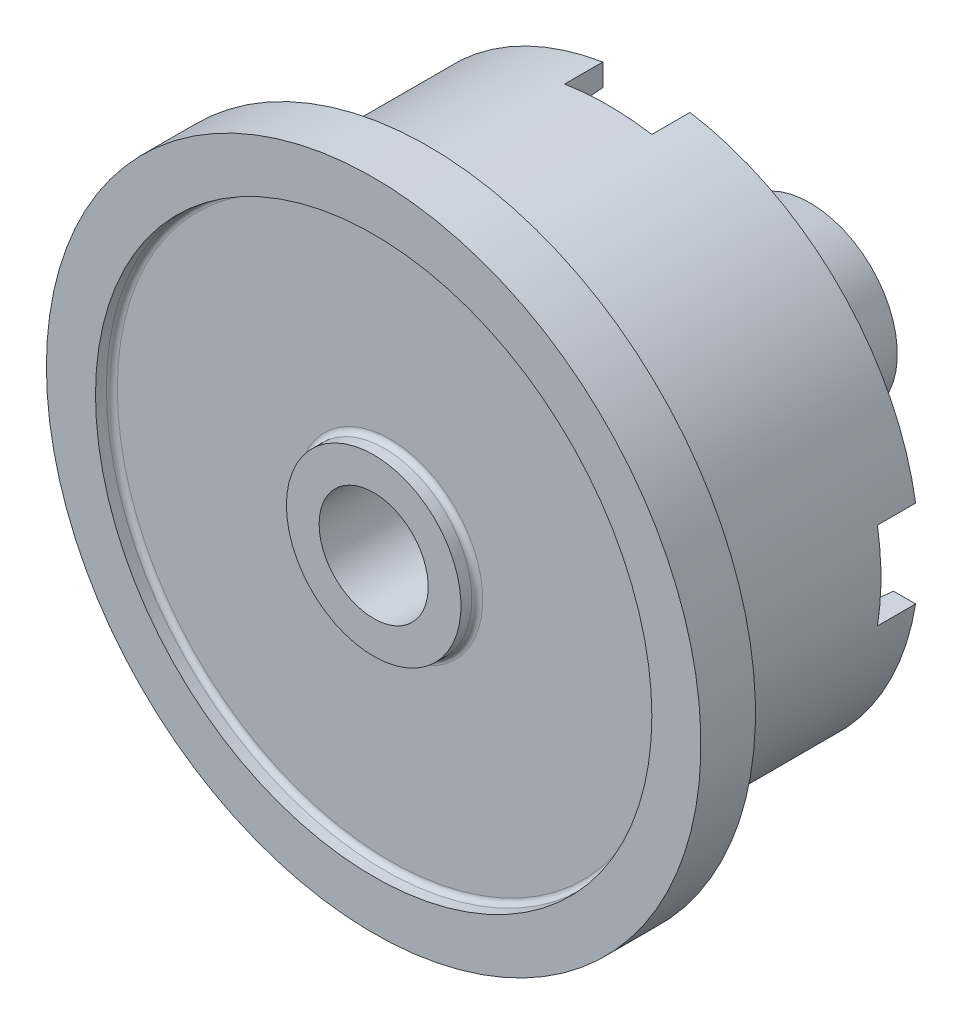
ISO-10303-21;
HEADER;
FILE_DESCRIPTION(('STEP AP214'),'2;1');
FILE_NAME('part.step','',(''),(''),'','','');
FILE_SCHEMA(('AUTOMOTIVE_DESIGN { 1 0 10303 214 1 1 1 1 }'));
ENDSEC;
DATA;
#1=APPLICATION_CONTEXT('core data for automotive mechanical design processes');
#2=APPLICATION_PROTOCOL_DEFINITION('international standard','automotive_design',2000,#1);
#3=PRODUCT_CONTEXT('',#1,'mechanical');
#4=PRODUCT('Part','Part','',(#3));
#5=PRODUCT_RELATED_PRODUCT_CATEGORY('part','',(#4));
#6=PRODUCT_DEFINITION_FORMATION('','',#4);
#7=PRODUCT_DEFINITION_CONTEXT('part definition',#1,'design');
#8=PRODUCT_DEFINITION('design','',#6,#7);
#9=PRODUCT_DEFINITION_SHAPE('','',#8);
#10=(LENGTH_UNIT() NAMED_UNIT(*) SI_UNIT(.MILLI.,.METRE.));
#11=(NAMED_UNIT(*) PLANE_ANGLE_UNIT() SI_UNIT($,.RADIAN.));
#12=(NAMED_UNIT(*) SI_UNIT($,.STERADIAN.) SOLID_ANGLE_UNIT());
#13=UNCERTAINTY_MEASURE_WITH_UNIT(LENGTH_MEASURE(1.E-05),#10,'distance_accuracy_value','');
#14=(GEOMETRIC_REPRESENTATION_CONTEXT(3) GLOBAL_UNCERTAINTY_ASSIGNED_CONTEXT((#13)) GLOBAL_UNIT_ASSIGNED_CONTEXT((#10,
#11,#12)) REPRESENTATION_CONTEXT('',''));
#15=CARTESIAN_POINT('',(0.,0.,0.));
#16=DIRECTION('',(0.,0.,1.));
#17=DIRECTION('',(1.,0.,0.));
#18=AXIS2_PLACEMENT_3D('',#15,#16,#17);
#19=CARTESIAN_POINT('',(10.,0.,70.));
#20=DIRECTION('',(0.,0.,-1.));
#21=DIRECTION('',(-1.,0.,0.));
#22=AXIS2_PLACEMENT_3D('',#19,#20,#21);
#23=CONICAL_SURFACE('',#22,42.,0.0996686524911617);
#24=CARTESIAN_POINT('',(10.,0.,70.));
#25=DIRECTION('',(0.,0.,-1.));
#26=DIRECTION('',(-1.,0.,0.));
#27=AXIS2_PLACEMENT_3D('',#24,#25,#26);
#28=CIRCLE('',#27,42.);
#29=CARTESIAN_POINT('',(-32.,0.,70.));
#30=VERTEX_POINT('',#29);
#31=EDGE_CURVE('E294',#30,#30,#28,.T.);
#32=ORIENTED_EDGE('',*,*,#31,.F.);
#33=EDGE_LOOP('',(#32));
#34=FACE_BOUND('',#33,.T.);
#35=CARTESIAN_POINT('',(10.,0.,30.));
#36=DIRECTION('',(0.,0.,-1.));
#37=DIRECTION('',(-1.,0.,0.));
#38=AXIS2_PLACEMENT_3D('',#35,#36,#37);
#39=CIRCLE('',#38,46.);
#40=CARTESIAN_POINT('',(-35.2990066116245,8.,30.));
#41=VERTEX_POINT('',#40);
#42=CARTESIAN_POINT('',(2.00000000000016,45.2990066116245,30.));
#43=VERTEX_POINT('',#42);
#44=EDGE_CURVE('E291',#41,#43,#39,.T.);
#45=ORIENTED_EDGE('',*,*,#44,.T.);
#46=CARTESIAN_POINT('',(2.00000000000016,46.8538409665136,14.6809057785133));
#47=CARTESIAN_POINT('',(2.00000000000016,46.3048760230467,20.0924536551285));
#48=CARTESIAN_POINT('',(2.00000000000016,45.7556094728386,25.5039709018128));
#49=CARTESIAN_POINT('',(2.00000000000016,44.6564731588152,36.3269441365454));
#50=CARTESIAN_POINT('',(2.00000000000016,44.1066033949999,41.7384001245937));
#51=CARTESIAN_POINT('',(2.00000000000016,43.5564320244431,47.1498254827112));
#52=B_SPLINE_CURVE_WITH_KNOTS('',3,(#46,#47,#48,#49,#50,#51),.UNSPECIFIED.,.F.,.F.,(4,2,4),(0.,
16.3179629209363,32.6359258455688),.UNSPECIFIED.);
#53=CARTESIAN_POINT('',(2.00000000000016,44.5880028707275,37.));
#54=VERTEX_POINT('',#53);
#55=EDGE_CURVE('E365',#43,#54,#52,.T.);
#56=ORIENTED_EDGE('',*,*,#55,.T.);
#57=CARTESIAN_POINT('',(10.,0.,37.));
#58=DIRECTION('',(0.,0.,-1.));
#59=DIRECTION('',(-1.,0.,0.));
#60=AXIS2_PLACEMENT_3D('',#57,#58,#59);
#61=CIRCLE('',#60,45.3);
#62=CARTESIAN_POINT('',(18.0000000000002,44.5880028707274,37.));
#63=VERTEX_POINT('',#62);
#64=EDGE_CURVE('E377',#54,#63,#61,.T.);
#65=ORIENTED_EDGE('',*,*,#64,.T.);
#66=CARTESIAN_POINT('',(18.0000000000002,46.8538409665135,14.6809057785133));
#67=CARTESIAN_POINT('',(18.0000000000002,46.3048760230467,20.0924536551285));
#68=CARTESIAN_POINT('',(18.0000000000002,45.7556094728385,25.5039709018128));
#69=CARTESIAN_POINT('',(18.0000000000002,44.6564731588152,36.3269441365454));
#70=CARTESIAN_POINT('',(18.0000000000002,44.1066033949998,41.7384001245937));
#71=CARTESIAN_POINT('',(18.0000000000002,43.5564320244431,47.1498254827112));
#72=B_SPLINE_CURVE_WITH_KNOTS('',3,(#66,#67,#68,#69,#70,#71),.UNSPECIFIED.,.F.,.F.,(4,2,4),(0.,
16.3179629209363,32.6359258455688),.UNSPECIFIED.);
#73=CARTESIAN_POINT('',(18.0000000000002,45.2990066116245,30.));
#74=VERTEX_POINT('',#73);
#75=EDGE_CURVE('E167',#74,#63,#72,.T.);
#76=ORIENTED_EDGE('',*,*,#75,.F.);
#77=CARTESIAN_POINT('',(55.2990066116245,8.,30.));
#78=VERTEX_POINT('',#77);
#79=EDGE_CURVE('E295',#74,#78,#39,.T.);
#80=ORIENTED_EDGE('',*,*,#79,.T.);
#81=CARTESIAN_POINT('',(56.8538409665136,8.,14.6809057785133));
#82=CARTESIAN_POINT('',(56.3048760230467,8.,20.0924536551285));
#83=CARTESIAN_POINT('',(55.7556094728386,8.,25.5039709018128));
#84=CARTESIAN_POINT('',(54.6564731588152,8.,36.3269441365454));
#85=CARTESIAN_POINT('',(54.1066033949999,8.,41.7384001245937));
#86=CARTESIAN_POINT('',(53.5564320244431,8.,47.1498254827112));
#87=B_SPLINE_CURVE_WITH_KNOTS('',3,(#81,#82,#83,#84,#85,#86),.UNSPECIFIED.,.F.,.F.,(4,2,4),(0.,
16.3179629209363,32.6359258455688),.UNSPECIFIED.);
#88=CARTESIAN_POINT('',(54.5880028707275,8.,37.));
#89=VERTEX_POINT('',#88);
#90=EDGE_CURVE('E442',#78,#89,#87,.T.);
#91=ORIENTED_EDGE('',*,*,#90,.T.);
#92=CARTESIAN_POINT('',(10.,0.,37.));
#93=DIRECTION('',(0.,0.,-1.));
#94=DIRECTION('',(-1.,0.,0.));
#95=AXIS2_PLACEMENT_3D('',#92,#93,#94);
#96=CIRCLE('',#95,45.3);
#97=CARTESIAN_POINT('',(54.5880028707275,-8.,37.));
#98=VERTEX_POINT('',#97);
#99=EDGE_CURVE('E451',#89,#98,#96,.T.);
#100=ORIENTED_EDGE('',*,*,#99,.T.);
#101=CARTESIAN_POINT('',(56.8538409665136,-8.,14.6809057785133));
#102=CARTESIAN_POINT('',(56.3048760230467,-8.,20.0924536551285));
#103=CARTESIAN_POINT('',(55.7556094728386,-8.,25.5039709018128));
#104=CARTESIAN_POINT('',(54.6564731588152,-8.,36.3269441365454));
#105=CARTESIAN_POINT('',(54.1066033949999,-8.,41.7384001245937));
#106=CARTESIAN_POINT('',(53.5564320244431,-8.,47.1498254827112));
#107=B_SPLINE_CURVE_WITH_KNOTS('',3,(#101,#102,#103,#104,#105,#106),.UNSPECIFIED.,.F.,.F.,(4,2,
4),(0.,16.3179629209363,32.6359258455688),.UNSPECIFIED.);
#108=CARTESIAN_POINT('',(55.2990066116245,-8.,30.));
#109=VERTEX_POINT('',#108);
#110=EDGE_CURVE('E447',#109,#98,#107,.T.);
#111=ORIENTED_EDGE('',*,*,#110,.F.);
#112=CARTESIAN_POINT('',(17.9999999999995,-45.2990066116246,30.));
#113=VERTEX_POINT('',#112);
#114=EDGE_CURVE('E379',#109,#113,#39,.T.);
#115=ORIENTED_EDGE('',*,*,#114,.T.);
#116=CARTESIAN_POINT('',(17.9999999999995,-46.8538409665136,14.6809057785134));
#117=CARTESIAN_POINT('',(17.9999999999995,-46.3048760230468,20.0924536551285));
#118=CARTESIAN_POINT('',(17.9999999999995,-45.7556094728386,25.5039709018128));
#119=CARTESIAN_POINT('',(17.9999999999995,-44.6564731588153,36.3269441365454));
#120=CARTESIAN_POINT('',(17.9999999999995,-44.1066033949999,41.7384001245937));
#121=CARTESIAN_POINT('',(17.9999999999995,-43.5564320244432,47.1498254827111));
#122=B_SPLINE_CURVE_WITH_KNOTS('',3,(#116,#117,#118,#119,#120,#121),.UNSPECIFIED.,.F.,.F.,(4,2,
4),(0.,16.3179629209362,32.6359258455687),.UNSPECIFIED.);
#123=CARTESIAN_POINT('',(17.9999999999995,-44.5880028707275,37.));
#124=VERTEX_POINT('',#123);
#125=EDGE_CURVE('E233',#113,#124,#122,.T.);
#126=ORIENTED_EDGE('',*,*,#125,.T.);
#127=CARTESIAN_POINT('',(10.,0.,37.));
#128=DIRECTION('',(0.,0.,-1.));
#129=DIRECTION('',(-1.,0.,0.));
#130=AXIS2_PLACEMENT_3D('',#127,#128,#129);
#131=CIRCLE('',#130,45.3);
#132=CARTESIAN_POINT('',(1.99999999999954,-44.5880028707274,37.));
#133=VERTEX_POINT('',#132);
#134=EDGE_CURVE('E184',#124,#133,#131,.T.);
#135=ORIENTED_EDGE('',*,*,#134,.T.);
#136=CARTESIAN_POINT('',(1.99999999999951,-46.8538409665135,14.6809057785133));
#137=CARTESIAN_POINT('',(1.99999999999952,-46.3048760230466,20.0924536551284));
#138=CARTESIAN_POINT('',(1.99999999999952,-45.7556094728385,25.5039709018127));
#139=CARTESIAN_POINT('',(1.99999999999954,-44.6564731588151,36.3269441365454));
#140=CARTESIAN_POINT('',(1.99999999999954,-44.1066033949998,41.7384001245938));
#141=CARTESIAN_POINT('',(1.99999999999955,-43.556432024443,47.1498254827112));
#142=B_SPLINE_CURVE_WITH_KNOTS('',3,(#136,#137,#138,#139,#140,#141),.UNSPECIFIED.,.F.,.F.,(4,2,
4),(0.,16.3179629209364,32.6359258455689),.UNSPECIFIED.);
#143=CARTESIAN_POINT('',(1.99999999999953,-45.2990066116244,30.));
#144=VERTEX_POINT('',#143);
#145=EDGE_CURVE('E226',#144,#133,#142,.T.);
#146=ORIENTED_EDGE('',*,*,#145,.F.);
#147=CARTESIAN_POINT('',(-35.2990066116245,-8.,30.));
#148=VERTEX_POINT('',#147);
#149=EDGE_CURVE('E290',#144,#148,#39,.T.);
#150=ORIENTED_EDGE('',*,*,#149,.T.);
#151=CARTESIAN_POINT('',(-36.8538409665136,-8.,14.6809057785133));
#152=CARTESIAN_POINT('',(-36.3048760230467,-8.,20.0924536551285));
#153=CARTESIAN_POINT('',(-35.7556094728385,-8.,25.5039709018128));
#154=CARTESIAN_POINT('',(-34.6564731588152,-8.,36.3269441365454));
#155=CARTESIAN_POINT('',(-34.1066033949998,-8.,41.7384001245937));
#156=CARTESIAN_POINT('',(-33.5564320244431,-8.,47.1498254827112));
#157=B_SPLINE_CURVE_WITH_KNOTS('',3,(#151,#152,#153,#154,#155,#156),.UNSPECIFIED.,.F.,.F.,(4,2,
4),(0.,16.3179629209363,32.6359258455688),.UNSPECIFIED.);
#158=CARTESIAN_POINT('',(-34.5880028707275,-8.,37.));
#159=VERTEX_POINT('',#158);
#160=EDGE_CURVE('E265',#148,#159,#157,.T.);
#161=ORIENTED_EDGE('',*,*,#160,.T.);
#162=CARTESIAN_POINT('',(10.,0.,37.));
#163=DIRECTION('',(0.,0.,-1.));
#164=DIRECTION('',(-1.,0.,0.));
#165=AXIS2_PLACEMENT_3D('',#162,#163,#164);
#166=CIRCLE('',#165,45.3);
#167=CARTESIAN_POINT('',(-34.5880028707275,8.,37.));
#168=VERTEX_POINT('',#167);
#169=EDGE_CURVE('E407',#159,#168,#166,.T.);
#170=ORIENTED_EDGE('',*,*,#169,.T.);
#171=CARTESIAN_POINT('',(-36.8538409665136,8.,14.6809057785133));
#172=CARTESIAN_POINT('',(-36.3048760230467,8.,20.0924536551285));
#173=CARTESIAN_POINT('',(-35.7556094728385,8.,25.5039709018128));
#174=CARTESIAN_POINT('',(-34.6564731588152,8.,36.3269441365454));
#175=CARTESIAN_POINT('',(-34.1066033949998,8.,41.7384001245937));
#176=CARTESIAN_POINT('',(-33.5564320244431,8.,47.1498254827112));
#177=B_SPLINE_CURVE_WITH_KNOTS('',3,(#171,#172,#173,#174,#175,#176),.UNSPECIFIED.,.F.,.F.,(4,2,
4),(0.,16.3179629209363,32.6359258455688),.UNSPECIFIED.);
#178=EDGE_CURVE('E273',#41,#168,#177,.T.);
#179=ORIENTED_EDGE('',*,*,#178,.F.);
#180=EDGE_LOOP('',(#45,#56,#65,#76,#80,#91,#100,#111,#115,#126,#135,#146,#150,#161,#170,#179));
#181=FACE_BOUND('',#180,.T.);
#182=ADVANCED_FACE('F47',(#34,#181),#23,.F.);
#183=CARTESIAN_POINT('',(-40.,0.,30.));
#184=DIRECTION('',(0.,0.,-1.));
#185=DIRECTION('',(-1.,0.,0.));
#186=AXIS2_PLACEMENT_3D('',#183,#184,#185);
#187=PLANE('',#186);
#188=CARTESIAN_POINT('',(10.,0.,30.));
#189=DIRECTION('',(0.,0.,-1.));
#190=DIRECTION('',(-1.,0.,0.));
#191=AXIS2_PLACEMENT_3D('',#188,#189,#190);
#192=CIRCLE('',#191,50.);
#193=CARTESIAN_POINT('',(-39.3558507170123,8.,30.));
#194=VERTEX_POINT('',#193);
#195=CARTESIAN_POINT('',(2.00000000000017,49.3558507170123,30.));
#196=VERTEX_POINT('',#195);
#197=EDGE_CURVE('E287',#194,#196,#192,.T.);
#198=ORIENTED_EDGE('',*,*,#197,.T.);
#199=DIRECTION('',(0.,-1.,0.));
#200=VECTOR('',#199,1.);
#201=CARTESIAN_POINT('',(2.00000000000005,10.,30.));
#202=LINE('',#201,#200);
#203=EDGE_CURVE('E175',#196,#43,#202,.T.);
#204=ORIENTED_EDGE('',*,*,#203,.T.);
#205=ORIENTED_EDGE('',*,*,#44,.F.);
#206=DIRECTION('',(1.,0.,0.));
#207=VECTOR('',#206,1.);
#208=CARTESIAN_POINT('',(0.,8.,30.));
#209=LINE('',#208,#207);
#210=EDGE_CURVE('E369',#194,#41,#209,.T.);
#211=ORIENTED_EDGE('',*,*,#210,.F.);
#212=EDGE_LOOP('',(#198,#204,#205,#211));
#213=FACE_BOUND('',#212,.T.);
#214=ADVANCED_FACE('F352',(#213),#187,.T.);
#215=DIRECTION('',(0.,-1.,0.));
#216=VECTOR('',#215,1.);
#217=CARTESIAN_POINT('',(18.,9.99999999999997,30.));
#218=LINE('',#217,#216);
#219=CARTESIAN_POINT('',(18.0000000000002,49.3558507170123,30.));
#220=VERTEX_POINT('',#219);
#221=EDGE_CURVE('E204',#220,#74,#218,.T.);
#222=ORIENTED_EDGE('',*,*,#221,.F.);
#223=CARTESIAN_POINT('',(59.3558507170123,8.,30.));
#224=VERTEX_POINT('',#223);
#225=EDGE_CURVE('E181',#220,#224,#192,.T.);
#226=ORIENTED_EDGE('',*,*,#225,.T.);
#227=DIRECTION('',(-1.,0.,0.));
#228=VECTOR('',#227,1.);
#229=CARTESIAN_POINT('',(20.,7.99999999999999,30.));
#230=LINE('',#229,#228);
#231=EDGE_CURVE('E192',#224,#78,#230,.T.);
#232=ORIENTED_EDGE('',*,*,#231,.T.);
#233=ORIENTED_EDGE('',*,*,#79,.F.);
#234=EDGE_LOOP('',(#222,#226,#232,#233));
#235=FACE_BOUND('',#234,.T.);
#236=ADVANCED_FACE('F357',(#235),#187,.T.);
#237=DIRECTION('',(-1.,0.,0.));
#238=VECTOR('',#237,1.);
#239=CARTESIAN_POINT('',(20.,-8.,30.));
#240=LINE('',#239,#238);
#241=CARTESIAN_POINT('',(59.3558507170123,-8.,30.));
#242=VERTEX_POINT('',#241);
#243=EDGE_CURVE('E197',#242,#109,#240,.T.);
#244=ORIENTED_EDGE('',*,*,#243,.F.);
#245=CARTESIAN_POINT('',(17.9999999999995,-49.3558507170124,30.));
#246=VERTEX_POINT('',#245);
#247=EDGE_CURVE('E460',#242,#246,#192,.T.);
#248=ORIENTED_EDGE('',*,*,#247,.T.);
#249=DIRECTION('',(0.,1.,0.));
#250=VECTOR('',#249,1.);
#251=CARTESIAN_POINT('',(17.9999999999999,-10.0000000000001,30.));
#252=LINE('',#251,#250);
#253=EDGE_CURVE('E210',#246,#113,#252,.T.);
#254=ORIENTED_EDGE('',*,*,#253,.T.);
#255=ORIENTED_EDGE('',*,*,#114,.F.);
#256=EDGE_LOOP('',(#244,#248,#254,#255));
#257=FACE_BOUND('',#256,.T.);
#258=ADVANCED_FACE('F458',(#257),#187,.T.);
#259=CARTESIAN_POINT('',(10.,0.,0.));
#260=DIRECTION('',(0.,0.,-1.));
#261=DIRECTION('',(-1.,0.,0.));
#262=AXIS2_PLACEMENT_3D('',#259,#260,#261);
#263=CYLINDRICAL_SURFACE('',#262,50.);
#264=CARTESIAN_POINT('',(10.,0.,70.));
#265=DIRECTION('',(0.,0.,-1.));
#266=DIRECTION('',(-1.,0.,0.));
#267=AXIS2_PLACEMENT_3D('',#264,#265,#266);
#268=CIRCLE('',#267,50.);
#269=CARTESIAN_POINT('',(-40.,0.,70.));
#270=VERTEX_POINT('',#269);
#271=EDGE_CURVE('E283',#270,#270,#268,.T.);
#272=ORIENTED_EDGE('',*,*,#271,.T.);
#273=EDGE_LOOP('',(#272));
#274=FACE_BOUND('',#273,.T.);
#275=CARTESIAN_POINT('',(10.,0.,37.));
#276=DIRECTION('',(0.,0.,-1.));
#277=DIRECTION('',(0.,1.,0.));
#278=AXIS2_PLACEMENT_3D('',#275,#276,#277);
#279=CIRCLE('',#278,50.);
#280=CARTESIAN_POINT('',(2.00000000000018,49.3558507170123,37.));
#281=VERTEX_POINT('',#280);
#282=CARTESIAN_POINT('',(18.0000000000002,49.3558507170123,37.));
#283=VERTEX_POINT('',#282);
#284=EDGE_CURVE('E169',#281,#283,#279,.T.);
#285=ORIENTED_EDGE('',*,*,#284,.F.);
#286=DIRECTION('',(0.,0.,-1.));
#287=VECTOR('',#286,1.);
#288=CARTESIAN_POINT('',(2.00000000000017,49.3558507170123,37.));
#289=LINE('',#288,#287);
#290=EDGE_CURVE('E182',#281,#196,#289,.T.);
#291=ORIENTED_EDGE('',*,*,#290,.T.);
#292=ORIENTED_EDGE('',*,*,#197,.F.);
#293=DIRECTION('',(0.,0.,-1.));
#294=VECTOR('',#293,1.);
#295=CARTESIAN_POINT('',(-39.3558507170123,8.,37.));
#296=LINE('',#295,#294);
#297=CARTESIAN_POINT('',(-39.3558507170123,8.,37.));
#298=VERTEX_POINT('',#297);
#299=EDGE_CURVE('E408',#298,#194,#296,.T.);
#300=ORIENTED_EDGE('',*,*,#299,.F.);
#301=CARTESIAN_POINT('',(10.,0.,37.));
#302=DIRECTION('',(0.,0.,-1.));
#303=DIRECTION('',(-1.,0.,0.));
#304=AXIS2_PLACEMENT_3D('',#301,#302,#303);
#305=CIRCLE('',#304,50.);
#306=CARTESIAN_POINT('',(-39.3558507170123,-8.,37.));
#307=VERTEX_POINT('',#306);
#308=EDGE_CURVE('E397',#307,#298,#305,.T.);
#309=ORIENTED_EDGE('',*,*,#308,.F.);
#310=DIRECTION('',(0.,0.,-1.));
#311=VECTOR('',#310,1.);
#312=CARTESIAN_POINT('',(-39.3558507170123,-8.,37.));
#313=LINE('',#312,#311);
#314=CARTESIAN_POINT('',(-39.3558507170123,-8.,30.));
#315=VERTEX_POINT('',#314);
#316=EDGE_CURVE('E405',#307,#315,#313,.T.);
#317=ORIENTED_EDGE('',*,*,#316,.T.);
#318=CARTESIAN_POINT('',(1.99999999999949,-49.3558507170122,30.));
#319=VERTEX_POINT('',#318);
#320=EDGE_CURVE('E286',#319,#315,#192,.T.);
#321=ORIENTED_EDGE('',*,*,#320,.F.);
#322=DIRECTION('',(0.,0.,-1.));
#323=VECTOR('',#322,1.);
#324=CARTESIAN_POINT('',(1.99999999999949,-49.3558507170122,37.));
#325=LINE('',#324,#323);
#326=CARTESIAN_POINT('',(1.99999999999949,-49.3558507170122,37.));
#327=VERTEX_POINT('',#326);
#328=EDGE_CURVE('E216',#327,#319,#325,.T.);
#329=ORIENTED_EDGE('',*,*,#328,.F.);
#330=CARTESIAN_POINT('',(10.,0.,37.));
#331=DIRECTION('',(0.,0.,-1.));
#332=DIRECTION('',(0.,-1.,0.));
#333=AXIS2_PLACEMENT_3D('',#330,#331,#332);
#334=CIRCLE('',#333,50.);
#335=CARTESIAN_POINT('',(17.9999999999995,-49.3558507170124,37.));
#336=VERTEX_POINT('',#335);
#337=EDGE_CURVE('E206',#336,#327,#334,.T.);
#338=ORIENTED_EDGE('',*,*,#337,.F.);
#339=DIRECTION('',(0.,0.,-1.));
#340=VECTOR('',#339,1.);
#341=CARTESIAN_POINT('',(17.9999999999995,-49.3558507170124,37.));
#342=LINE('',#341,#340);
#343=EDGE_CURVE('E199',#336,#246,#342,.T.);
#344=ORIENTED_EDGE('',*,*,#343,.T.);
#345=ORIENTED_EDGE('',*,*,#247,.F.);
#346=DIRECTION('',(0.,0.,-1.));
#347=VECTOR('',#346,1.);
#348=CARTESIAN_POINT('',(59.3558507170123,-8.,37.));
#349=LINE('',#348,#347);
#350=CARTESIAN_POINT('',(59.3558507170123,-8.,37.));
#351=VERTEX_POINT('',#350);
#352=EDGE_CURVE('E196',#351,#242,#349,.T.);
#353=ORIENTED_EDGE('',*,*,#352,.F.);
#354=CARTESIAN_POINT('',(10.,0.,37.));
#355=DIRECTION('',(0.,0.,-1.));
#356=DIRECTION('',(1.,0.,0.));
#357=AXIS2_PLACEMENT_3D('',#354,#355,#356);
#358=CIRCLE('',#357,50.);
#359=CARTESIAN_POINT('',(59.3558507170123,8.,37.));
#360=VERTEX_POINT('',#359);
#361=EDGE_CURVE('E189',#360,#351,#358,.T.);
#362=ORIENTED_EDGE('',*,*,#361,.F.);
#363=DIRECTION('',(0.,0.,-1.));
#364=VECTOR('',#363,1.);
#365=CARTESIAN_POINT('',(59.3558507170123,8.,37.));
#366=LINE('',#365,#364);
#367=EDGE_CURVE('E202',#360,#224,#366,.T.);
#368=ORIENTED_EDGE('',*,*,#367,.T.);
#369=ORIENTED_EDGE('',*,*,#225,.F.);
#370=DIRECTION('',(0.,0.,-1.));
#371=VECTOR('',#370,1.);
#372=CARTESIAN_POINT('',(18.0000000000002,49.3558507170123,37.));
#373=LINE('',#372,#371);
#374=EDGE_CURVE('E164',#283,#220,#373,.T.);
#375=ORIENTED_EDGE('',*,*,#374,.F.);
#376=EDGE_LOOP('',(#285,#291,#292,#300,#309,#317,#321,#329,#338,#344,#345,#353,#362,#368,#369,#375));
#377=FACE_BOUND('',#376,.T.);
#378=ADVANCED_FACE('F178',(#274,#377),#263,.T.);
#379=DIRECTION('',(0.,1.,0.));
#380=VECTOR('',#379,1.);
#381=CARTESIAN_POINT('',(1.9999999999999,-9.99999999999992,30.));
#382=LINE('',#381,#380);
#383=EDGE_CURVE('E217',#319,#144,#382,.T.);
#384=ORIENTED_EDGE('',*,*,#383,.F.);
#385=ORIENTED_EDGE('',*,*,#320,.T.);
#386=DIRECTION('',(1.,0.,0.));
#387=VECTOR('',#386,1.);
#388=CARTESIAN_POINT('',(0.,-7.99999999999999,30.));
#389=LINE('',#388,#387);
#390=EDGE_CURVE('E393',#315,#148,#389,.T.);
#391=ORIENTED_EDGE('',*,*,#390,.T.);
#392=ORIENTED_EDGE('',*,*,#149,.F.);
#393=EDGE_LOOP('',(#384,#385,#391,#392));
#394=FACE_BOUND('',#393,.T.);
#395=ADVANCED_FACE('F359',(#394),#187,.T.);
#396=CARTESIAN_POINT('',(-50.,0.,80.));
#397=DIRECTION('',(0.,0.,1.));
#398=DIRECTION('',(1.,0.,0.));
#399=AXIS2_PLACEMENT_3D('',#396,#397,#398);
#400=PLANE('',#399);
#401=CARTESIAN_POINT('',(10.,0.,80.));
#402=DIRECTION('',(0.,0.,-1.));
#403=DIRECTION('',(-1.,0.,0.));
#404=AXIS2_PLACEMENT_3D('',#401,#402,#403);
#405=CIRCLE('',#404,51.);
#406=CARTESIAN_POINT('',(-41.,0.,80.));
#407=VERTEX_POINT('',#406);
#408=EDGE_CURVE('E13',#407,#407,#405,.T.);
#409=ORIENTED_EDGE('',*,*,#408,.T.);
#410=EDGE_LOOP('',(#409));
#411=FACE_BOUND('',#410,.T.);
#412=CARTESIAN_POINT('',(10.,0.,80.));
#413=DIRECTION('',(0.,0.,-1.));
#414=DIRECTION('',(-1.,0.,0.));
#415=AXIS2_PLACEMENT_3D('',#412,#413,#414);
#416=CIRCLE('',#415,60.);
#417=CARTESIAN_POINT('',(-50.,0.,80.));
#418=VERTEX_POINT('',#417);
#419=EDGE_CURVE('E272',#418,#418,#416,.T.);
#420=ORIENTED_EDGE('',*,*,#419,.F.);
#421=EDGE_LOOP('',(#420));
#422=FACE_BOUND('',#421,.T.);
#423=ADVANCED_FACE('F49',(#411,#422),#400,.T.);
#424=CARTESIAN_POINT('',(10.,0.,0.));
#425=DIRECTION('',(0.,0.,-1.));
#426=DIRECTION('',(-1.,0.,0.));
#427=AXIS2_PLACEMENT_3D('',#424,#425,#426);
#428=CYLINDRICAL_SURFACE('',#427,51.);
#429=CARTESIAN_POINT('',(10.,0.,78.));
#430=DIRECTION('',(0.,0.,-1.));
#431=DIRECTION('',(-1.,0.,0.));
#432=AXIS2_PLACEMENT_3D('',#429,#430,#431);
#433=CIRCLE('',#432,51.);
#434=CARTESIAN_POINT('',(-41.,0.,78.));
#435=VERTEX_POINT('',#434);
#436=EDGE_CURVE('E55',#435,#435,#433,.T.);
#437=ORIENTED_EDGE('',*,*,#436,.T.);
#438=EDGE_LOOP('',(#437));
#439=FACE_BOUND('',#438,.T.);
#440=ORIENTED_EDGE('',*,*,#408,.F.);
#441=EDGE_LOOP('',(#440));
#442=FACE_BOUND('',#441,.T.);
#443=ADVANCED_FACE('F336',(#439,#442),#428,.F.);
#444=CARTESIAN_POINT('',(10.,0.,78.));
#445=DIRECTION('',(0.,0.,-1.));
#446=DIRECTION('',(-1.,0.,0.));
#447=AXIS2_PLACEMENT_3D('',#444,#445,#446);
#448=TOROIDAL_SURFACE('',#447,50.,1.);
#449=CARTESIAN_POINT('',(10.,0.,77.));
#450=DIRECTION('',(0.,0.,-1.));
#451=DIRECTION('',(-1.,0.,0.));
#452=AXIS2_PLACEMENT_3D('',#449,#450,#451);
#453=CIRCLE('',#452,50.);
#454=CARTESIAN_POINT('',(-40.,0.,77.));
#455=VERTEX_POINT('',#454);
#456=EDGE_CURVE('E331',#455,#455,#453,.T.);
#457=ORIENTED_EDGE('',*,*,#456,.T.);
#458=EDGE_LOOP('',(#457));
#459=FACE_BOUND('',#458,.T.);
#460=ORIENTED_EDGE('',*,*,#436,.F.);
#461=EDGE_LOOP('',(#460));
#462=FACE_BOUND('',#461,.T.);
#463=ADVANCED_FACE('F339',(#459,#462),#448,.F.);
#464=CARTESIAN_POINT('',(-40.,0.,77.));
#465=DIRECTION('',(0.,0.,1.));
#466=DIRECTION('',(1.,0.,0.));
#467=AXIS2_PLACEMENT_3D('',#464,#465,#466);
#468=PLANE('',#467);
#469=CARTESIAN_POINT('',(10.,0.,77.));
#470=DIRECTION('',(0.,0.,-1.));
#471=DIRECTION('',(-1.,0.,0.));
#472=AXIS2_PLACEMENT_3D('',#469,#470,#471);
#473=CIRCLE('',#472,17.);
#474=CARTESIAN_POINT('',(-6.99999999999999,0.,77.));
#475=VERTEX_POINT('',#474);
#476=EDGE_CURVE('E328',#475,#475,#473,.T.);
#477=ORIENTED_EDGE('',*,*,#476,.T.);
#478=EDGE_LOOP('',(#477));
#479=FACE_BOUND('',#478,.T.);
#480=ORIENTED_EDGE('',*,*,#456,.F.);
#481=EDGE_LOOP('',(#480));
#482=FACE_BOUND('',#481,.T.);
#483=ADVANCED_FACE('F341',(#479,#482),#468,.T.);
#484=CARTESIAN_POINT('',(10.,0.,78.));
#485=DIRECTION('',(0.,0.,-1.));
#486=DIRECTION('',(-1.,0.,0.));
#487=AXIS2_PLACEMENT_3D('',#484,#485,#486);
#488=TOROIDAL_SURFACE('',#487,17.,1.);
#489=CARTESIAN_POINT('',(10.,0.,78.));
#490=DIRECTION('',(0.,0.,-1.));
#491=DIRECTION('',(-1.,0.,0.));
#492=AXIS2_PLACEMENT_3D('',#489,#490,#491);
#493=CIRCLE('',#492,16.);
#494=CARTESIAN_POINT('',(-5.99999999999999,0.,78.));
#495=VERTEX_POINT('',#494);
#496=EDGE_CURVE('E325',#495,#495,#493,.T.);
#497=ORIENTED_EDGE('',*,*,#496,.T.);
#498=EDGE_LOOP('',(#497));
#499=FACE_BOUND('',#498,.T.);
#500=ORIENTED_EDGE('',*,*,#476,.F.);
#501=EDGE_LOOP('',(#500));
#502=FACE_BOUND('',#501,.T.);
#503=ADVANCED_FACE('F348',(#499,#502),#488,.F.);
#504=CARTESIAN_POINT('',(10.,0.,0.));
#505=DIRECTION('',(0.,0.,-1.));
#506=DIRECTION('',(-1.,0.,0.));
#507=AXIS2_PLACEMENT_3D('',#504,#505,#506);
#508=CYLINDRICAL_SURFACE('',#507,16.);
#509=CARTESIAN_POINT('',(10.,0.,80.));
#510=DIRECTION('',(0.,0.,-1.));
#511=DIRECTION('',(-1.,0.,0.));
#512=AXIS2_PLACEMENT_3D('',#509,#510,#511);
#513=CIRCLE('',#512,16.);
#514=CARTESIAN_POINT('',(-5.99999999999999,0.,80.));
#515=VERTEX_POINT('',#514);
#516=EDGE_CURVE('E322',#515,#515,#513,.T.);
#517=ORIENTED_EDGE('',*,*,#516,.T.);
#518=EDGE_LOOP('',(#517));
#519=FACE_BOUND('',#518,.T.);
#520=ORIENTED_EDGE('',*,*,#496,.F.);
#521=EDGE_LOOP('',(#520));
#522=FACE_BOUND('',#521,.T.);
#523=ADVANCED_FACE('F689',(#519,#522),#508,.T.);
#524=CARTESIAN_POINT('',(-5.99999999999999,0.,80.));
#525=DIRECTION('',(0.,0.,1.));
#526=DIRECTION('',(1.,0.,0.));
#527=AXIS2_PLACEMENT_3D('',#524,#525,#526);
#528=PLANE('',#527);
#529=CARTESIAN_POINT('',(10.,0.,80.));
#530=DIRECTION('',(0.,0.,-1.));
#531=DIRECTION('',(-1.,0.,0.));
#532=AXIS2_PLACEMENT_3D('',#529,#530,#531);
#533=CIRCLE('',#532,10.);
#534=CARTESIAN_POINT('',(0.,0.,80.));
#535=VERTEX_POINT('',#534);
#536=EDGE_CURVE('E319',#535,#535,#533,.T.);
#537=ORIENTED_EDGE('',*,*,#536,.T.);
#538=EDGE_LOOP('',(#537));
#539=FACE_BOUND('',#538,.T.);
#540=ORIENTED_EDGE('',*,*,#516,.F.);
#541=EDGE_LOOP('',(#540));
#542=FACE_BOUND('',#541,.T.);
#543=ADVANCED_FACE('F679',(#539,#542),#528,.T.);
#544=CARTESIAN_POINT('',(10.,0.,0.));
#545=DIRECTION('',(0.,0.,-1.));
#546=DIRECTION('',(-1.,0.,0.));
#547=AXIS2_PLACEMENT_3D('',#544,#545,#546);
#548=CYLINDRICAL_SURFACE('',#547,10.);
#549=CARTESIAN_POINT('',(10.,0.,60.));
#550=DIRECTION('',(0.,0.,-1.));
#551=DIRECTION('',(-1.,0.,0.));
#552=AXIS2_PLACEMENT_3D('',#549,#550,#551);
#553=CIRCLE('',#552,10.);
#554=CARTESIAN_POINT('',(0.,0.,60.));
#555=VERTEX_POINT('',#554);
#556=EDGE_CURVE('E316',#555,#555,#553,.T.);
#557=ORIENTED_EDGE('',*,*,#556,.T.);
#558=EDGE_LOOP('',(#557));
#559=FACE_BOUND('',#558,.T.);
#560=ORIENTED_EDGE('',*,*,#536,.F.);
#561=EDGE_LOOP('',(#560));
#562=FACE_BOUND('',#561,.T.);
#563=ADVANCED_FACE('F669',(#559,#562),#548,.F.);
#564=CARTESIAN_POINT('',(0.,0.,60.));
#565=DIRECTION('',(0.,0.,-1.));
#566=DIRECTION('',(-1.,0.,0.));
#567=AXIS2_PLACEMENT_3D('',#564,#565,#566);
#568=PLANE('',#567);
#569=CARTESIAN_POINT('',(10.,0.,60.));
#570=DIRECTION('',(0.,0.,-1.));
#571=DIRECTION('',(-1.,0.,0.));
#572=AXIS2_PLACEMENT_3D('',#569,#570,#571);
#573=CIRCLE('',#572,12.);
#574=CARTESIAN_POINT('',(-1.99999999999999,0.,60.));
#575=VERTEX_POINT('',#574);
#576=EDGE_CURVE('E313',#575,#575,#573,.T.);
#577=ORIENTED_EDGE('',*,*,#576,.T.);
#578=EDGE_LOOP('',(#577));
#579=FACE_BOUND('',#578,.T.);
#580=ORIENTED_EDGE('',*,*,#556,.F.);
#581=EDGE_LOOP('',(#580));
#582=FACE_BOUND('',#581,.T.);
#583=ADVANCED_FACE('F659',(#579,#582),#568,.T.);
#584=CARTESIAN_POINT('',(10.,0.,0.));
#585=DIRECTION('',(0.,0.,-1.));
#586=DIRECTION('',(-1.,0.,0.));
#587=AXIS2_PLACEMENT_3D('',#584,#585,#586);
#588=CYLINDRICAL_SURFACE('',#587,12.);
#589=CARTESIAN_POINT('',(10.,0.,20.));
#590=DIRECTION('',(0.,0.,-1.));
#591=DIRECTION('',(-1.,0.,0.));
#592=AXIS2_PLACEMENT_3D('',#589,#590,#591);
#593=CIRCLE('',#592,12.);
#594=CARTESIAN_POINT('',(-1.99999999999999,0.,20.));
#595=VERTEX_POINT('',#594);
#596=EDGE_CURVE('E310',#595,#595,#593,.T.);
#597=ORIENTED_EDGE('',*,*,#596,.T.);
#598=EDGE_LOOP('',(#597));
#599=FACE_BOUND('',#598,.T.);
#600=ORIENTED_EDGE('',*,*,#576,.F.);
#601=EDGE_LOOP('',(#600));
#602=FACE_BOUND('',#601,.T.);
#603=ADVANCED_FACE('F649',(#599,#602),#588,.F.);
#604=CARTESIAN_POINT('',(0.,0.,20.));
#605=DIRECTION('',(0.,0.,1.));
#606=DIRECTION('',(1.,0.,0.));
#607=AXIS2_PLACEMENT_3D('',#604,#605,#606);
#608=PLANE('',#607);
#609=CARTESIAN_POINT('',(10.,0.,20.));
#610=DIRECTION('',(0.,0.,-1.));
#611=DIRECTION('',(-1.,0.,0.));
#612=AXIS2_PLACEMENT_3D('',#609,#610,#611);
#613=CIRCLE('',#612,10.);
#614=CARTESIAN_POINT('',(0.,0.,20.));
#615=VERTEX_POINT('',#614);
#616=EDGE_CURVE('E307',#615,#615,#613,.T.);
#617=ORIENTED_EDGE('',*,*,#616,.T.);
#618=EDGE_LOOP('',(#617));
#619=FACE_BOUND('',#618,.T.);
#620=ORIENTED_EDGE('',*,*,#596,.F.);
#621=EDGE_LOOP('',(#620));
#622=FACE_BOUND('',#621,.T.);
#623=ADVANCED_FACE('F639',(#619,#622),#608,.T.);
#624=CARTESIAN_POINT('',(10.,0.,0.));
#625=DIRECTION('',(0.,0.,-1.));
#626=DIRECTION('',(-1.,0.,0.));
#627=AXIS2_PLACEMENT_3D('',#624,#625,#626);
#628=CYLINDRICAL_SURFACE('',#627,10.);
#629=CARTESIAN_POINT('',(10.,0.,0.));
#630=DIRECTION('',(0.,0.,-1.));
#631=DIRECTION('',(-1.,0.,0.));
#632=AXIS2_PLACEMENT_3D('',#629,#630,#631);
#633=CIRCLE('',#632,10.);
#634=CARTESIAN_POINT('',(0.,0.,0.));
#635=VERTEX_POINT('',#634);
#636=EDGE_CURVE('E304',#635,#635,#633,.T.);
#637=ORIENTED_EDGE('',*,*,#636,.T.);
#638=EDGE_LOOP('',(#637));
#639=FACE_BOUND('',#638,.T.);
#640=ORIENTED_EDGE('',*,*,#616,.F.);
#641=EDGE_LOOP('',(#640));
#642=FACE_BOUND('',#641,.T.);
#643=ADVANCED_FACE('F629',(#639,#642),#628,.F.);
#644=CARTESIAN_POINT('',(0.,0.,0.));
#645=DIRECTION('',(0.,0.,-1.));
#646=DIRECTION('',(-1.,0.,0.));
#647=AXIS2_PLACEMENT_3D('',#644,#645,#646);
#648=PLANE('',#647);
#649=CARTESIAN_POINT('',(10.,0.,0.));
#650=DIRECTION('',(0.,0.,-1.));
#651=DIRECTION('',(-1.,0.,0.));
#652=AXIS2_PLACEMENT_3D('',#649,#650,#651);
#653=CIRCLE('',#652,16.);
#654=CARTESIAN_POINT('',(-6.,0.,0.));
#655=VERTEX_POINT('',#654);
#656=EDGE_CURVE('E301',#655,#655,#653,.T.);
#657=ORIENTED_EDGE('',*,*,#656,.T.);
#658=EDGE_LOOP('',(#657));
#659=FACE_BOUND('',#658,.T.);
#660=ORIENTED_EDGE('',*,*,#636,.F.);
#661=EDGE_LOOP('',(#660));
#662=FACE_BOUND('',#661,.T.);
#663=ADVANCED_FACE('F619',(#659,#662),#648,.T.);
#664=CARTESIAN_POINT('',(10.,0.,0.));
#665=DIRECTION('',(0.,0.,1.));
#666=DIRECTION('',(1.,0.,0.));
#667=AXIS2_PLACEMENT_3D('',#664,#665,#666);
#668=CONICAL_SURFACE('',#667,16.,0.141897054604164);
#669=CARTESIAN_POINT('',(10.,0.,70.));
#670=DIRECTION('',(0.,0.,-1.));
#671=DIRECTION('',(-1.,0.,0.));
#672=AXIS2_PLACEMENT_3D('',#669,#670,#671);
#673=CIRCLE('',#672,26.);
#674=CARTESIAN_POINT('',(-16.,0.,70.));
#675=VERTEX_POINT('',#674);
#676=EDGE_CURVE('E298',#675,#675,#673,.T.);
#677=ORIENTED_EDGE('',*,*,#676,.T.);
#678=EDGE_LOOP('',(#677));
#679=FACE_BOUND('',#678,.T.);
#680=ORIENTED_EDGE('',*,*,#656,.F.);
#681=EDGE_LOOP('',(#680));
#682=FACE_BOUND('',#681,.T.);
#683=ADVANCED_FACE('F610',(#679,#682),#668,.T.);
#684=CARTESIAN_POINT('',(-32.,0.,70.));
#685=DIRECTION('',(0.,0.,-1.));
#686=DIRECTION('',(-1.,0.,0.));
#687=AXIS2_PLACEMENT_3D('',#684,#685,#686);
#688=PLANE('',#687);
#689=ORIENTED_EDGE('',*,*,#31,.T.);
#690=EDGE_LOOP('',(#689));
#691=FACE_BOUND('',#690,.T.);
#692=ORIENTED_EDGE('',*,*,#676,.F.);
#693=EDGE_LOOP('',(#692));
#694=FACE_BOUND('',#693,.T.);
#695=ADVANCED_FACE('F600',(#691,#694),#688,.T.);
#696=CARTESIAN_POINT('',(-50.,0.,70.));
#697=DIRECTION('',(0.,0.,-1.));
#698=DIRECTION('',(-1.,0.,0.));
#699=AXIS2_PLACEMENT_3D('',#696,#697,#698);
#700=PLANE('',#699);
#701=CARTESIAN_POINT('',(10.,0.,70.));
#702=DIRECTION('',(0.,0.,-1.));
#703=DIRECTION('',(-1.,0.,0.));
#704=AXIS2_PLACEMENT_3D('',#701,#702,#703);
#705=CIRCLE('',#704,60.);
#706=CARTESIAN_POINT('',(-50.,0.,70.));
#707=VERTEX_POINT('',#706);
#708=EDGE_CURVE('E280',#707,#707,#705,.T.);
#709=ORIENTED_EDGE('',*,*,#708,.T.);
#710=EDGE_LOOP('',(#709));
#711=FACE_BOUND('',#710,.T.);
#712=ORIENTED_EDGE('',*,*,#271,.F.);
#713=EDGE_LOOP('',(#712));
#714=FACE_BOUND('',#713,.T.);
#715=ADVANCED_FACE('F591',(#711,#714),#700,.T.);
#716=CARTESIAN_POINT('',(10.,0.,0.));
#717=DIRECTION('',(0.,0.,-1.));
#718=DIRECTION('',(-1.,0.,0.));
#719=AXIS2_PLACEMENT_3D('',#716,#717,#718);
#720=CYLINDRICAL_SURFACE('',#719,60.);
#721=ORIENTED_EDGE('',*,*,#419,.T.);
#722=EDGE_LOOP('',(#721));
#723=FACE_BOUND('',#722,.T.);
#724=ORIENTED_EDGE('',*,*,#708,.F.);
#725=EDGE_LOOP('',(#724));
#726=FACE_BOUND('',#725,.T.);
#727=ADVANCED_FACE('F260',(#723,#726),#720,.T.);
#728=CARTESIAN_POINT('',(0.,-7.99999999999999,37.));
#729=DIRECTION('',(0.,1.,0.));
#730=DIRECTION('',(-1.,0.,0.));
#731=AXIS2_PLACEMENT_3D('',#728,#729,#730);
#732=PLANE('',#731);
#733=ORIENTED_EDGE('',*,*,#390,.F.);
#734=ORIENTED_EDGE('',*,*,#316,.F.);
#735=DIRECTION('',(1.,0.,0.));
#736=VECTOR('',#735,1.);
#737=CARTESIAN_POINT('',(0.,-7.99999999999999,37.));
#738=LINE('',#737,#736);
#739=EDGE_CURVE('E395',#307,#159,#738,.T.);
#740=ORIENTED_EDGE('',*,*,#739,.T.);
#741=ORIENTED_EDGE('',*,*,#160,.F.);
#742=EDGE_LOOP('',(#733,#734,#740,#741));
#743=FACE_BOUND('',#742,.T.);
#744=ADVANCED_FACE('F256',(#743),#732,.T.);
#745=CARTESIAN_POINT('',(0.,8.,37.));
#746=DIRECTION('',(0.,1.,0.));
#747=DIRECTION('',(0.,0.,1.));
#748=AXIS2_PLACEMENT_3D('',#745,#746,#747);
#749=PLANE('',#748);
#750=ORIENTED_EDGE('',*,*,#178,.T.);
#751=DIRECTION('',(1.,0.,0.));
#752=VECTOR('',#751,1.);
#753=CARTESIAN_POINT('',(0.,8.,37.));
#754=LINE('',#753,#752);
#755=EDGE_CURVE('E400',#298,#168,#754,.T.);
#756=ORIENTED_EDGE('',*,*,#755,.F.);
#757=ORIENTED_EDGE('',*,*,#299,.T.);
#758=ORIENTED_EDGE('',*,*,#210,.T.);
#759=EDGE_LOOP('',(#750,#756,#757,#758));
#760=FACE_BOUND('',#759,.T.);
#761=ADVANCED_FACE('F254',(#760),#749,.F.);
#762=CARTESIAN_POINT('',(0.,0.,37.));
#763=DIRECTION('',(0.,0.,-1.));
#764=DIRECTION('',(-1.,0.,0.));
#765=AXIS2_PLACEMENT_3D('',#762,#763,#764);
#766=PLANE('',#765);
#767=ORIENTED_EDGE('',*,*,#739,.F.);
#768=ORIENTED_EDGE('',*,*,#308,.T.);
#769=ORIENTED_EDGE('',*,*,#755,.T.);
#770=ORIENTED_EDGE('',*,*,#169,.F.);
#771=EDGE_LOOP('',(#767,#768,#769,#770));
#772=FACE_BOUND('',#771,.T.);
#773=ADVANCED_FACE('F251',(#772),#766,.T.);
#774=CARTESIAN_POINT('',(17.9999999999999,-10.0000000000001,37.));
#775=DIRECTION('',(-1.,0.,0.));
#776=DIRECTION('',(0.,-1.,0.));
#777=AXIS2_PLACEMENT_3D('',#774,#775,#776);
#778=PLANE('',#777);
#779=ORIENTED_EDGE('',*,*,#253,.F.);
#780=ORIENTED_EDGE('',*,*,#343,.F.);
#781=DIRECTION('',(0.,1.,0.));
#782=VECTOR('',#781,1.);
#783=CARTESIAN_POINT('',(17.9999999999999,-10.0000000000001,37.));
#784=LINE('',#783,#782);
#785=EDGE_CURVE('E213',#336,#124,#784,.T.);
#786=ORIENTED_EDGE('',*,*,#785,.T.);
#787=ORIENTED_EDGE('',*,*,#125,.F.);
#788=EDGE_LOOP('',(#779,#780,#786,#787));
#789=FACE_BOUND('',#788,.T.);
#790=ADVANCED_FACE('F247',(#789),#778,.T.);
#791=CARTESIAN_POINT('',(1.9999999999999,-9.99999999999992,37.));
#792=DIRECTION('',(-1.,0.,0.));
#793=DIRECTION('',(0.,-1.,0.));
#794=AXIS2_PLACEMENT_3D('',#791,#792,#793);
#795=PLANE('',#794);
#796=ORIENTED_EDGE('',*,*,#145,.T.);
#797=DIRECTION('',(0.,1.,0.));
#798=VECTOR('',#797,1.);
#799=CARTESIAN_POINT('',(1.9999999999999,-9.99999999999992,37.));
#800=LINE('',#799,#798);
#801=EDGE_CURVE('E209',#327,#133,#800,.T.);
#802=ORIENTED_EDGE('',*,*,#801,.F.);
#803=ORIENTED_EDGE('',*,*,#328,.T.);
#804=ORIENTED_EDGE('',*,*,#383,.T.);
#805=EDGE_LOOP('',(#796,#802,#803,#804));
#806=FACE_BOUND('',#805,.T.);
#807=ADVANCED_FACE('F242',(#806),#795,.F.);
#808=CARTESIAN_POINT('',(9.9999999999999,-10.,37.));
#809=DIRECTION('',(0.,0.,-1.));
#810=DIRECTION('',(0.,-1.,0.));
#811=AXIS2_PLACEMENT_3D('',#808,#809,#810);
#812=PLANE('',#811);
#813=ORIENTED_EDGE('',*,*,#785,.F.);
#814=ORIENTED_EDGE('',*,*,#337,.T.);
#815=ORIENTED_EDGE('',*,*,#801,.T.);
#816=ORIENTED_EDGE('',*,*,#134,.F.);
#817=EDGE_LOOP('',(#813,#814,#815,#816));
#818=FACE_BOUND('',#817,.T.);
#819=ADVANCED_FACE('F246',(#818),#812,.T.);
#820=CARTESIAN_POINT('',(20.,7.99999999999999,37.));
#821=DIRECTION('',(0.,-1.,0.));
#822=DIRECTION('',(1.,0.,0.));
#823=AXIS2_PLACEMENT_3D('',#820,#821,#822);
#824=PLANE('',#823);
#825=ORIENTED_EDGE('',*,*,#231,.F.);
#826=ORIENTED_EDGE('',*,*,#367,.F.);
#827=DIRECTION('',(-1.,0.,0.));
#828=VECTOR('',#827,1.);
#829=CARTESIAN_POINT('',(20.,7.99999999999999,37.));
#830=LINE('',#829,#828);
#831=EDGE_CURVE('E70',#360,#89,#830,.T.);
#832=ORIENTED_EDGE('',*,*,#831,.T.);
#833=ORIENTED_EDGE('',*,*,#90,.F.);
#834=EDGE_LOOP('',(#825,#826,#832,#833));
#835=FACE_BOUND('',#834,.T.);
#836=ADVANCED_FACE('F435',(#835),#824,.T.);
#837=CARTESIAN_POINT('',(20.,-8.,37.));
#838=DIRECTION('',(0.,-1.,0.));
#839=DIRECTION('',(0.,0.,-1.));
#840=AXIS2_PLACEMENT_3D('',#837,#838,#839);
#841=PLANE('',#840);
#842=ORIENTED_EDGE('',*,*,#110,.T.);
#843=DIRECTION('',(-1.,0.,0.));
#844=VECTOR('',#843,1.);
#845=CARTESIAN_POINT('',(20.,-8.,37.));
#846=LINE('',#845,#844);
#847=EDGE_CURVE('E191',#351,#98,#846,.T.);
#848=ORIENTED_EDGE('',*,*,#847,.F.);
#849=ORIENTED_EDGE('',*,*,#352,.T.);
#850=ORIENTED_EDGE('',*,*,#243,.T.);
#851=EDGE_LOOP('',(#842,#848,#849,#850));
#852=FACE_BOUND('',#851,.T.);
#853=ADVANCED_FACE('F434',(#852),#841,.F.);
#854=CARTESIAN_POINT('',(20.,0.,37.));
#855=DIRECTION('',(0.,0.,-1.));
#856=DIRECTION('',(1.,0.,0.));
#857=AXIS2_PLACEMENT_3D('',#854,#855,#856);
#858=PLANE('',#857);
#859=ORIENTED_EDGE('',*,*,#831,.F.);
#860=ORIENTED_EDGE('',*,*,#361,.T.);
#861=ORIENTED_EDGE('',*,*,#847,.T.);
#862=ORIENTED_EDGE('',*,*,#99,.F.);
#863=EDGE_LOOP('',(#859,#860,#861,#862));
#864=FACE_BOUND('',#863,.T.);
#865=ADVANCED_FACE('F428',(#864),#858,.T.);
#866=CARTESIAN_POINT('',(2.00000000000005,10.,37.));
#867=DIRECTION('',(1.,0.,0.));
#868=DIRECTION('',(0.,1.,0.));
#869=AXIS2_PLACEMENT_3D('',#866,#867,#868);
#870=PLANE('',#869);
#871=ORIENTED_EDGE('',*,*,#203,.F.);
#872=ORIENTED_EDGE('',*,*,#290,.F.);
#873=DIRECTION('',(0.,-1.,0.));
#874=VECTOR('',#873,1.);
#875=CARTESIAN_POINT('',(2.00000000000005,10.,37.));
#876=LINE('',#875,#874);
#877=EDGE_CURVE('E62',#281,#54,#876,.T.);
#878=ORIENTED_EDGE('',*,*,#877,.T.);
#879=ORIENTED_EDGE('',*,*,#55,.F.);
#880=EDGE_LOOP('',(#871,#872,#878,#879));
#881=FACE_BOUND('',#880,.T.);
#882=ADVANCED_FACE('F424',(#881),#870,.T.);
#883=CARTESIAN_POINT('',(18.,9.99999999999997,37.));
#884=DIRECTION('',(1.,0.,0.));
#885=DIRECTION('',(0.,1.,0.));
#886=AXIS2_PLACEMENT_3D('',#883,#884,#885);
#887=PLANE('',#886);
#888=ORIENTED_EDGE('',*,*,#75,.T.);
#889=DIRECTION('',(0.,-1.,0.));
#890=VECTOR('',#889,1.);
#891=CARTESIAN_POINT('',(18.,9.99999999999997,37.));
#892=LINE('',#891,#890);
#893=EDGE_CURVE('E161',#283,#63,#892,.T.);
#894=ORIENTED_EDGE('',*,*,#893,.F.);
#895=ORIENTED_EDGE('',*,*,#374,.T.);
#896=ORIENTED_EDGE('',*,*,#221,.T.);
#897=EDGE_LOOP('',(#888,#894,#895,#896));
#898=FACE_BOUND('',#897,.T.);
#899=ADVANCED_FACE('F162',(#898),#887,.F.);
#900=CARTESIAN_POINT('',(10.,10.,37.));
#901=DIRECTION('',(0.,0.,-1.));
#902=DIRECTION('',(0.,1.,0.));
#903=AXIS2_PLACEMENT_3D('',#900,#901,#902);
#904=PLANE('',#903);
#905=ORIENTED_EDGE('',*,*,#877,.F.);
#906=ORIENTED_EDGE('',*,*,#284,.T.);
#907=ORIENTED_EDGE('',*,*,#893,.T.);
#908=ORIENTED_EDGE('',*,*,#64,.F.);
#909=EDGE_LOOP('',(#905,#906,#907,#908));
#910=FACE_BOUND('',#909,.T.);
#911=ADVANCED_FACE('F172',(#910),#904,.T.);
#912=CLOSED_SHELL('',(#182,#214,#236,#258,#378,#395,#423,#443,#463,#483,#503,#523,#543,#563,
#583,#603,#623,#643,#663,#683,#695,#715,#727,#744,#761,#773,#790,#807,#819,#836,#853,#865,#882,
#899,#911));
#913=MANIFOLD_SOLID_BREP('B2',#912);
#914=ADVANCED_BREP_SHAPE_REPRESENTATION('',(#18,#913),#14);
#915=SHAPE_DEFINITION_REPRESENTATION(#9,#914);
ENDSEC;
END-ISO-10303-21;
